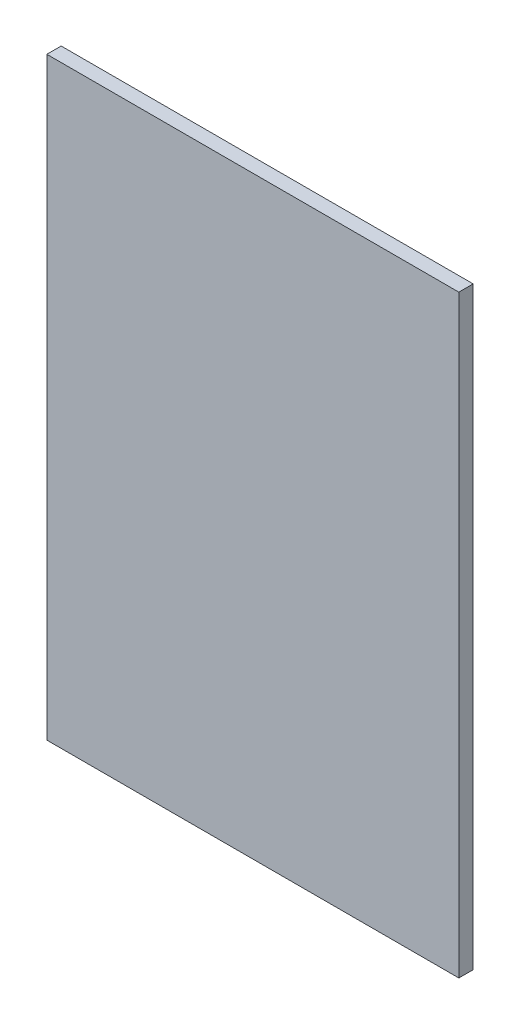
ISO-10303-21;
HEADER;
FILE_DESCRIPTION(('STEP AP214'),'2;1');
FILE_NAME('part.step','',(''),(''),'','','');
FILE_SCHEMA(('AUTOMOTIVE_DESIGN { 1 0 10303 214 1 1 1 1 }'));
ENDSEC;
DATA;
#1=APPLICATION_CONTEXT('core data for automotive mechanical design processes');
#2=APPLICATION_PROTOCOL_DEFINITION('international standard','automotive_design',2000,#1);
#3=PRODUCT_CONTEXT('',#1,'mechanical');
#4=PRODUCT('Part','Part','',(#3));
#5=PRODUCT_RELATED_PRODUCT_CATEGORY('part','',(#4));
#6=PRODUCT_DEFINITION_FORMATION('','',#4);
#7=PRODUCT_DEFINITION_CONTEXT('part definition',#1,'design');
#8=PRODUCT_DEFINITION('design','',#6,#7);
#9=PRODUCT_DEFINITION_SHAPE('','',#8);
#10=(LENGTH_UNIT() NAMED_UNIT(*) SI_UNIT(.MILLI.,.METRE.));
#11=(NAMED_UNIT(*) PLANE_ANGLE_UNIT() SI_UNIT($,.RADIAN.));
#12=(NAMED_UNIT(*) SI_UNIT($,.STERADIAN.) SOLID_ANGLE_UNIT());
#13=UNCERTAINTY_MEASURE_WITH_UNIT(LENGTH_MEASURE(1.E-05),#10,'distance_accuracy_value','');
#14=(GEOMETRIC_REPRESENTATION_CONTEXT(3) GLOBAL_UNCERTAINTY_ASSIGNED_CONTEXT((#13)) GLOBAL_UNIT_ASSIGNED_CONTEXT((#10,
#11,#12)) REPRESENTATION_CONTEXT('',''));
#15=CARTESIAN_POINT('',(0.,0.,0.));
#16=DIRECTION('',(0.,0.,1.));
#17=DIRECTION('',(1.,0.,0.));
#18=AXIS2_PLACEMENT_3D('',#15,#16,#17);
#19=CARTESIAN_POINT('',(0.,-28.,17.));
#20=DIRECTION('',(0.,-1.,0.));
#21=DIRECTION('',(0.,0.,-1.));
#22=AXIS2_PLACEMENT_3D('',#19,#20,#21);
#23=PLANE('',#22);
#24=DIRECTION('',(-1.,0.,0.));
#25=VECTOR('',#24,1.);
#26=CARTESIAN_POINT('',(0.,-28.,0.));
#27=LINE('',#26,#25);
#28=CARTESIAN_POINT('',(489.,-28.,0.));
#29=VERTEX_POINT('',#28);
#30=CARTESIAN_POINT('',(0.,-28.,0.));
#31=VERTEX_POINT('',#30);
#32=EDGE_CURVE('E96',#29,#31,#27,.T.);
#33=ORIENTED_EDGE('',*,*,#32,.T.);
#34=DIRECTION('',(0.,0.,-1.));
#35=VECTOR('',#34,1.);
#36=CARTESIAN_POINT('',(0.,-28.,17.));
#37=LINE('',#36,#35);
#38=CARTESIAN_POINT('',(0.,-28.,17.));
#39=VERTEX_POINT('',#38);
#40=EDGE_CURVE('E11',#39,#31,#37,.T.);
#41=ORIENTED_EDGE('',*,*,#40,.F.);
#42=DIRECTION('',(-1.,0.,0.));
#43=VECTOR('',#42,1.);
#44=CARTESIAN_POINT('',(0.,-28.,17.));
#45=LINE('',#44,#43);
#46=CARTESIAN_POINT('',(489.,-28.,17.));
#47=VERTEX_POINT('',#46);
#48=EDGE_CURVE('E84',#47,#39,#45,.T.);
#49=ORIENTED_EDGE('',*,*,#48,.F.);
#50=DIRECTION('',(0.,0.,-1.));
#51=VECTOR('',#50,1.);
#52=CARTESIAN_POINT('',(489.,-28.,17.));
#53=LINE('',#52,#51);
#54=EDGE_CURVE('E92',#47,#29,#53,.T.);
#55=ORIENTED_EDGE('',*,*,#54,.T.);
#56=EDGE_LOOP('',(#33,#41,#49,#55));
#57=FACE_BOUND('',#56,.T.);
#58=ADVANCED_FACE('F33',(#57),#23,.F.);
#59=CARTESIAN_POINT('',(0.,-28.,17.));
#60=DIRECTION('',(1.,0.,0.));
#61=DIRECTION('',(0.,0.,-1.));
#62=AXIS2_PLACEMENT_3D('',#59,#60,#61);
#63=PLANE('',#62);
#64=DIRECTION('',(0.,-1.,0.));
#65=VECTOR('',#64,1.);
#66=CARTESIAN_POINT('',(0.,-28.,0.));
#67=LINE('',#66,#65);
#68=CARTESIAN_POINT('',(0.,-733.,0.));
#69=VERTEX_POINT('',#68);
#70=EDGE_CURVE('E88',#31,#69,#67,.T.);
#71=ORIENTED_EDGE('',*,*,#70,.T.);
#72=DIRECTION('',(0.,0.,-1.));
#73=VECTOR('',#72,1.);
#74=CARTESIAN_POINT('',(0.,-733.,17.));
#75=LINE('',#74,#73);
#76=CARTESIAN_POINT('',(0.,-733.,17.));
#77=VERTEX_POINT('',#76);
#78=EDGE_CURVE('E41',#77,#69,#75,.T.);
#79=ORIENTED_EDGE('',*,*,#78,.F.);
#80=DIRECTION('',(0.,-1.,0.));
#81=VECTOR('',#80,1.);
#82=CARTESIAN_POINT('',(0.,-28.,17.));
#83=LINE('',#82,#81);
#84=EDGE_CURVE('E79',#39,#77,#83,.T.);
#85=ORIENTED_EDGE('',*,*,#84,.F.);
#86=ORIENTED_EDGE('',*,*,#40,.T.);
#87=EDGE_LOOP('',(#71,#79,#85,#86));
#88=FACE_BOUND('',#87,.T.);
#89=ADVANCED_FACE('F87',(#88),#63,.F.);
#90=CARTESIAN_POINT('',(0.,-733.,17.));
#91=DIRECTION('',(0.,1.,0.));
#92=DIRECTION('',(0.,0.,1.));
#93=AXIS2_PLACEMENT_3D('',#90,#91,#92);
#94=PLANE('',#93);
#95=DIRECTION('',(1.,0.,0.));
#96=VECTOR('',#95,1.);
#97=CARTESIAN_POINT('',(0.,-733.,0.));
#98=LINE('',#97,#96);
#99=CARTESIAN_POINT('',(489.,-733.,0.));
#100=VERTEX_POINT('',#99);
#101=EDGE_CURVE('E66',#69,#100,#98,.T.);
#102=ORIENTED_EDGE('',*,*,#101,.T.);
#103=DIRECTION('',(0.,0.,-1.));
#104=VECTOR('',#103,1.);
#105=CARTESIAN_POINT('',(489.,-733.,17.));
#106=LINE('',#105,#104);
#107=CARTESIAN_POINT('',(489.,-733.,17.));
#108=VERTEX_POINT('',#107);
#109=EDGE_CURVE('E89',#108,#100,#106,.T.);
#110=ORIENTED_EDGE('',*,*,#109,.F.);
#111=DIRECTION('',(1.,0.,0.));
#112=VECTOR('',#111,1.);
#113=CARTESIAN_POINT('',(0.,-733.,17.));
#114=LINE('',#113,#112);
#115=EDGE_CURVE('E82',#77,#108,#114,.T.);
#116=ORIENTED_EDGE('',*,*,#115,.F.);
#117=ORIENTED_EDGE('',*,*,#78,.T.);
#118=EDGE_LOOP('',(#102,#110,#116,#117));
#119=FACE_BOUND('',#118,.T.);
#120=ADVANCED_FACE('F90',(#119),#94,.F.);
#121=CARTESIAN_POINT('',(489.,-28.,17.));
#122=DIRECTION('',(-1.,0.,0.));
#123=DIRECTION('',(0.,0.,1.));
#124=AXIS2_PLACEMENT_3D('',#121,#122,#123);
#125=PLANE('',#124);
#126=DIRECTION('',(0.,1.,0.));
#127=VECTOR('',#126,1.);
#128=CARTESIAN_POINT('',(489.,-28.,0.));
#129=LINE('',#128,#127);
#130=EDGE_CURVE('E72',#100,#29,#129,.T.);
#131=ORIENTED_EDGE('',*,*,#130,.T.);
#132=ORIENTED_EDGE('',*,*,#54,.F.);
#133=DIRECTION('',(0.,1.,0.));
#134=VECTOR('',#133,1.);
#135=CARTESIAN_POINT('',(489.,-28.,17.));
#136=LINE('',#135,#134);
#137=EDGE_CURVE('E49',#108,#47,#136,.T.);
#138=ORIENTED_EDGE('',*,*,#137,.F.);
#139=ORIENTED_EDGE('',*,*,#109,.T.);
#140=EDGE_LOOP('',(#131,#132,#138,#139));
#141=FACE_BOUND('',#140,.T.);
#142=ADVANCED_FACE('F103',(#141),#125,.F.);
#143=CARTESIAN_POINT('',(0.,0.,17.));
#144=DIRECTION('',(0.,0.,-1.));
#145=DIRECTION('',(-1.,0.,0.));
#146=AXIS2_PLACEMENT_3D('',#143,#144,#145);
#147=PLANE('',#146);
#148=ORIENTED_EDGE('',*,*,#48,.T.);
#149=ORIENTED_EDGE('',*,*,#84,.T.);
#150=ORIENTED_EDGE('',*,*,#115,.T.);
#151=ORIENTED_EDGE('',*,*,#137,.T.);
#152=EDGE_LOOP('',(#148,#149,#150,#151));
#153=FACE_BOUND('',#152,.T.);
#154=ADVANCED_FACE('F80',(#153),#147,.F.);
#155=CARTESIAN_POINT('',(0.,0.,0.));
#156=DIRECTION('',(0.,0.,-1.));
#157=DIRECTION('',(-1.,0.,0.));
#158=AXIS2_PLACEMENT_3D('',#155,#156,#157);
#159=PLANE('',#158);
#160=ORIENTED_EDGE('',*,*,#32,.F.);
#161=ORIENTED_EDGE('',*,*,#130,.F.);
#162=ORIENTED_EDGE('',*,*,#101,.F.);
#163=ORIENTED_EDGE('',*,*,#70,.F.);
#164=EDGE_LOOP('',(#160,#161,#162,#163));
#165=FACE_BOUND('',#164,.T.);
#166=ADVANCED_FACE('F106',(#165),#159,.T.);
#167=CLOSED_SHELL('',(#58,#89,#120,#142,#154,#166));
#168=MANIFOLD_SOLID_BREP('B2',#167);
#169=ADVANCED_BREP_SHAPE_REPRESENTATION('',(#18,#168),#14);
#170=SHAPE_DEFINITION_REPRESENTATION(#9,#169);
ENDSEC;
END-ISO-10303-21;
